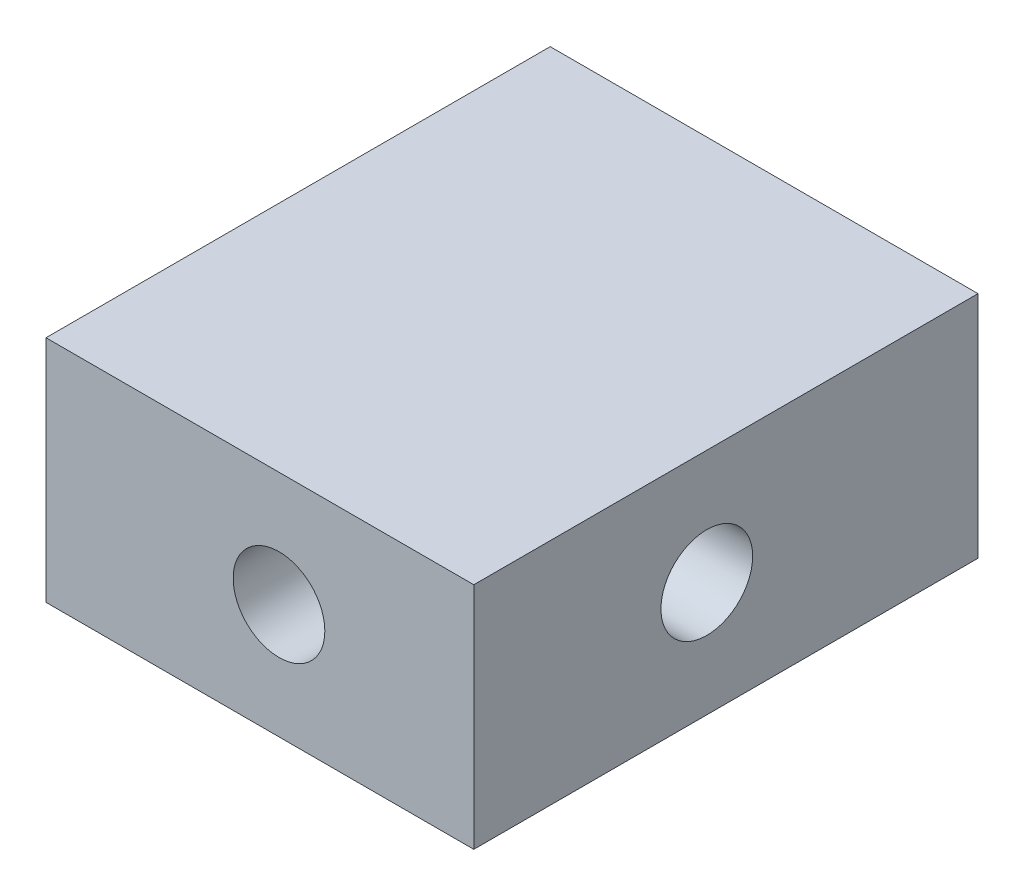
ISO-10303-21;
HEADER;
FILE_DESCRIPTION(('STEP AP214'),'2;1');
FILE_NAME('part.step','',(''),(''),'','','');
FILE_SCHEMA(('AUTOMOTIVE_DESIGN { 1 0 10303 214 1 1 1 1 }'));
ENDSEC;
DATA;
#1=APPLICATION_CONTEXT('core data for automotive mechanical design processes');
#2=APPLICATION_PROTOCOL_DEFINITION('international standard','automotive_design',2000,#1);
#3=PRODUCT_CONTEXT('',#1,'mechanical');
#4=PRODUCT('Part','Part','',(#3));
#5=PRODUCT_RELATED_PRODUCT_CATEGORY('part','',(#4));
#6=PRODUCT_DEFINITION_FORMATION('','',#4);
#7=PRODUCT_DEFINITION_CONTEXT('part definition',#1,'design');
#8=PRODUCT_DEFINITION('design','',#6,#7);
#9=PRODUCT_DEFINITION_SHAPE('','',#8);
#10=(LENGTH_UNIT() NAMED_UNIT(*) SI_UNIT(.MILLI.,.METRE.));
#11=(NAMED_UNIT(*) PLANE_ANGLE_UNIT() SI_UNIT($,.RADIAN.));
#12=(NAMED_UNIT(*) SI_UNIT($,.STERADIAN.) SOLID_ANGLE_UNIT());
#13=UNCERTAINTY_MEASURE_WITH_UNIT(LENGTH_MEASURE(1.E-05),#10,'distance_accuracy_value','');
#14=(GEOMETRIC_REPRESENTATION_CONTEXT(3) GLOBAL_UNCERTAINTY_ASSIGNED_CONTEXT((#13)) GLOBAL_UNIT_ASSIGNED_CONTEXT((#10,
#11,#12)) REPRESENTATION_CONTEXT('',''));
#15=CARTESIAN_POINT('',(0.,0.,0.));
#16=DIRECTION('',(0.,0.,1.));
#17=DIRECTION('',(1.,0.,0.));
#18=AXIS2_PLACEMENT_3D('',#15,#16,#17);
#19=CARTESIAN_POINT('',(0.,15.,0.));
#20=DIRECTION('',(1.,0.,0.));
#21=DIRECTION('',(0.,0.,-1.));
#22=AXIS2_PLACEMENT_3D('',#19,#20,#21);
#23=PLANE('',#22);
#24=DIRECTION('',(0.,0.,1.));
#25=VECTOR('',#24,1.);
#26=CARTESIAN_POINT('',(0.,0.,0.));
#27=LINE('',#26,#25);
#28=CARTESIAN_POINT('',(0.,0.,0.));
#29=VERTEX_POINT('',#28);
#30=CARTESIAN_POINT('',(0.,0.,33.));
#31=VERTEX_POINT('',#30);
#32=EDGE_CURVE('E101',#29,#31,#27,.T.);
#33=ORIENTED_EDGE('',*,*,#32,.T.);
#34=DIRECTION('',(0.,-1.,0.));
#35=VECTOR('',#34,1.);
#36=CARTESIAN_POINT('',(0.,15.,33.));
#37=LINE('',#36,#35);
#38=CARTESIAN_POINT('',(0.,15.,33.));
#39=VERTEX_POINT('',#38);
#40=EDGE_CURVE('E11',#39,#31,#37,.T.);
#41=ORIENTED_EDGE('',*,*,#40,.F.);
#42=DIRECTION('',(0.,0.,1.));
#43=VECTOR('',#42,1.);
#44=CARTESIAN_POINT('',(0.,15.,0.));
#45=LINE('',#44,#43);
#46=CARTESIAN_POINT('',(0.,15.,0.));
#47=VERTEX_POINT('',#46);
#48=EDGE_CURVE('E89',#47,#39,#45,.T.);
#49=ORIENTED_EDGE('',*,*,#48,.F.);
#50=DIRECTION('',(0.,-1.,0.));
#51=VECTOR('',#50,1.);
#52=CARTESIAN_POINT('',(0.,15.,0.));
#53=LINE('',#52,#51);
#54=EDGE_CURVE('E97',#47,#29,#53,.T.);
#55=ORIENTED_EDGE('',*,*,#54,.T.);
#56=EDGE_LOOP('',(#33,#41,#49,#55));
#57=FACE_BOUND('',#56,.T.);
#58=ADVANCED_FACE('F38',(#57),#23,.F.);
#59=CARTESIAN_POINT('',(0.,15.,33.));
#60=DIRECTION('',(0.,0.,-1.));
#61=DIRECTION('',(-1.,0.,0.));
#62=AXIS2_PLACEMENT_3D('',#59,#60,#61);
#63=PLANE('',#62);
#64=CARTESIAN_POINT('',(15.25,7.5,33.));
#65=DIRECTION('',(0.,0.,1.));
#66=DIRECTION('',(1.,0.,0.));
#67=AXIS2_PLACEMENT_3D('',#64,#65,#66);
#68=CIRCLE('',#67,3.);
#69=CARTESIAN_POINT('',(18.25,7.5,33.));
#70=VERTEX_POINT('',#69);
#71=EDGE_CURVE('E115',#70,#70,#68,.T.);
#72=ORIENTED_EDGE('',*,*,#71,.F.);
#73=EDGE_LOOP('',(#72));
#74=FACE_BOUND('',#73,.T.);
#75=DIRECTION('',(1.,0.,0.));
#76=VECTOR('',#75,1.);
#77=CARTESIAN_POINT('',(0.,0.,33.));
#78=LINE('',#77,#76);
#79=CARTESIAN_POINT('',(28.,0.,33.));
#80=VERTEX_POINT('',#79);
#81=EDGE_CURVE('E93',#31,#80,#78,.T.);
#82=ORIENTED_EDGE('',*,*,#81,.T.);
#83=DIRECTION('',(0.,-1.,0.));
#84=VECTOR('',#83,1.);
#85=CARTESIAN_POINT('',(28.,15.,33.));
#86=LINE('',#85,#84);
#87=CARTESIAN_POINT('',(28.,15.,33.));
#88=VERTEX_POINT('',#87);
#89=EDGE_CURVE('E46',#88,#80,#86,.T.);
#90=ORIENTED_EDGE('',*,*,#89,.F.);
#91=DIRECTION('',(1.,0.,0.));
#92=VECTOR('',#91,1.);
#93=CARTESIAN_POINT('',(0.,15.,33.));
#94=LINE('',#93,#92);
#95=EDGE_CURVE('E84',#39,#88,#94,.T.);
#96=ORIENTED_EDGE('',*,*,#95,.F.);
#97=ORIENTED_EDGE('',*,*,#40,.T.);
#98=EDGE_LOOP('',(#82,#90,#96,#97));
#99=FACE_BOUND('',#98,.T.);
#100=ADVANCED_FACE('F92',(#74,#99),#63,.F.);
#101=CARTESIAN_POINT('',(28.,15.,0.));
#102=DIRECTION('',(-1.,0.,0.));
#103=DIRECTION('',(0.,0.,1.));
#104=AXIS2_PLACEMENT_3D('',#101,#102,#103);
#105=PLANE('',#104);
#106=CARTESIAN_POINT('',(28.,7.5,17.75));
#107=DIRECTION('',(1.,0.,0.));
#108=DIRECTION('',(0.,0.,-1.));
#109=AXIS2_PLACEMENT_3D('',#106,#107,#108);
#110=CIRCLE('',#109,3.);
#111=CARTESIAN_POINT('',(28.,7.5,14.75));
#112=VERTEX_POINT('',#111);
#113=EDGE_CURVE('E121',#112,#112,#110,.T.);
#114=ORIENTED_EDGE('',*,*,#113,.F.);
#115=EDGE_LOOP('',(#114));
#116=FACE_BOUND('',#115,.T.);
#117=DIRECTION('',(0.,0.,-1.));
#118=VECTOR('',#117,1.);
#119=CARTESIAN_POINT('',(28.,0.,0.));
#120=LINE('',#119,#118);
#121=CARTESIAN_POINT('',(28.,0.,0.));
#122=VERTEX_POINT('',#121);
#123=EDGE_CURVE('E71',#80,#122,#120,.T.);
#124=ORIENTED_EDGE('',*,*,#123,.T.);
#125=DIRECTION('',(0.,-1.,0.));
#126=VECTOR('',#125,1.);
#127=CARTESIAN_POINT('',(28.,15.,0.));
#128=LINE('',#127,#126);
#129=CARTESIAN_POINT('',(28.,15.,0.));
#130=VERTEX_POINT('',#129);
#131=EDGE_CURVE('E94',#130,#122,#128,.T.);
#132=ORIENTED_EDGE('',*,*,#131,.F.);
#133=DIRECTION('',(0.,0.,-1.));
#134=VECTOR('',#133,1.);
#135=CARTESIAN_POINT('',(28.,15.,0.));
#136=LINE('',#135,#134);
#137=EDGE_CURVE('E87',#88,#130,#136,.T.);
#138=ORIENTED_EDGE('',*,*,#137,.F.);
#139=ORIENTED_EDGE('',*,*,#89,.T.);
#140=EDGE_LOOP('',(#124,#132,#138,#139));
#141=FACE_BOUND('',#140,.T.);
#142=ADVANCED_FACE('F95',(#116,#141),#105,.F.);
#143=CARTESIAN_POINT('',(0.,15.,0.));
#144=DIRECTION('',(0.,0.,1.));
#145=DIRECTION('',(1.,0.,0.));
#146=AXIS2_PLACEMENT_3D('',#143,#144,#145);
#147=PLANE('',#146);
#148=DIRECTION('',(-1.,0.,0.));
#149=VECTOR('',#148,1.);
#150=CARTESIAN_POINT('',(0.,0.,0.));
#151=LINE('',#150,#149);
#152=EDGE_CURVE('E77',#122,#29,#151,.T.);
#153=ORIENTED_EDGE('',*,*,#152,.T.);
#154=ORIENTED_EDGE('',*,*,#54,.F.);
#155=DIRECTION('',(-1.,0.,0.));
#156=VECTOR('',#155,1.);
#157=CARTESIAN_POINT('',(0.,15.,0.));
#158=LINE('',#157,#156);
#159=EDGE_CURVE('E54',#130,#47,#158,.T.);
#160=ORIENTED_EDGE('',*,*,#159,.F.);
#161=ORIENTED_EDGE('',*,*,#131,.T.);
#162=EDGE_LOOP('',(#153,#154,#160,#161));
#163=FACE_BOUND('',#162,.T.);
#164=ADVANCED_FACE('F109',(#163),#147,.F.);
#165=CARTESIAN_POINT('',(0.,15.,0.));
#166=DIRECTION('',(0.,1.,0.));
#167=DIRECTION('',(0.,0.,1.));
#168=AXIS2_PLACEMENT_3D('',#165,#166,#167);
#169=PLANE('',#168);
#170=ORIENTED_EDGE('',*,*,#48,.T.);
#171=ORIENTED_EDGE('',*,*,#95,.T.);
#172=ORIENTED_EDGE('',*,*,#137,.T.);
#173=ORIENTED_EDGE('',*,*,#159,.T.);
#174=EDGE_LOOP('',(#170,#171,#172,#173));
#175=FACE_BOUND('',#174,.T.);
#176=ADVANCED_FACE('F85',(#175),#169,.T.);
#177=CARTESIAN_POINT('',(0.,0.,0.));
#178=DIRECTION('',(0.,1.,0.));
#179=DIRECTION('',(0.,0.,1.));
#180=AXIS2_PLACEMENT_3D('',#177,#178,#179);
#181=PLANE('',#180);
#182=ORIENTED_EDGE('',*,*,#32,.F.);
#183=ORIENTED_EDGE('',*,*,#152,.F.);
#184=ORIENTED_EDGE('',*,*,#123,.F.);
#185=ORIENTED_EDGE('',*,*,#81,.F.);
#186=EDGE_LOOP('',(#182,#183,#184,#185));
#187=FACE_BOUND('',#186,.T.);
#188=ADVANCED_FACE('F112',(#187),#181,.F.);
#189=CARTESIAN_POINT('',(15.25,7.5,28.));
#190=DIRECTION('',(0.,0.,1.));
#191=DIRECTION('',(1.,0.,0.));
#192=AXIS2_PLACEMENT_3D('',#189,#190,#191);
#193=CYLINDRICAL_SURFACE('',#192,3.);
#194=CARTESIAN_POINT('',(15.25,7.5,28.));
#195=DIRECTION('',(0.,0.,1.));
#196=DIRECTION('',(1.,0.,0.));
#197=AXIS2_PLACEMENT_3D('',#194,#195,#196);
#198=CIRCLE('',#197,3.);
#199=CARTESIAN_POINT('',(18.25,7.5,28.));
#200=VERTEX_POINT('',#199);
#201=EDGE_CURVE('E104',#200,#200,#198,.T.);
#202=ORIENTED_EDGE('',*,*,#201,.F.);
#203=EDGE_LOOP('',(#202));
#204=FACE_BOUND('',#203,.T.);
#205=ORIENTED_EDGE('',*,*,#71,.T.);
#206=EDGE_LOOP('',(#205));
#207=FACE_BOUND('',#206,.T.);
#208=ADVANCED_FACE('F163',(#204,#207),#193,.F.);
#209=CARTESIAN_POINT('',(15.25,7.5,28.));
#210=DIRECTION('',(0.,0.,1.));
#211=DIRECTION('',(1.,0.,0.));
#212=AXIS2_PLACEMENT_3D('',#209,#210,#211);
#213=PLANE('',#212);
#214=ORIENTED_EDGE('',*,*,#201,.T.);
#215=EDGE_LOOP('',(#214));
#216=FACE_BOUND('',#215,.T.);
#217=ADVANCED_FACE('F132',(#216),#213,.T.);
#218=CARTESIAN_POINT('',(23.,7.5,17.75));
#219=DIRECTION('',(1.,0.,0.));
#220=DIRECTION('',(0.,0.,-1.));
#221=AXIS2_PLACEMENT_3D('',#218,#219,#220);
#222=CYLINDRICAL_SURFACE('',#221,3.);
#223=CARTESIAN_POINT('',(23.,7.5,17.75));
#224=DIRECTION('',(1.,0.,0.));
#225=DIRECTION('',(0.,0.,-1.));
#226=AXIS2_PLACEMENT_3D('',#223,#224,#225);
#227=CIRCLE('',#226,3.);
#228=CARTESIAN_POINT('',(23.,7.5,14.75));
#229=VERTEX_POINT('',#228);
#230=EDGE_CURVE('E118',#229,#229,#227,.T.);
#231=ORIENTED_EDGE('',*,*,#230,.F.);
#232=EDGE_LOOP('',(#231));
#233=FACE_BOUND('',#232,.T.);
#234=ORIENTED_EDGE('',*,*,#113,.T.);
#235=EDGE_LOOP('',(#234));
#236=FACE_BOUND('',#235,.T.);
#237=ADVANCED_FACE('F129',(#233,#236),#222,.F.);
#238=CARTESIAN_POINT('',(23.,7.5,17.75));
#239=DIRECTION('',(1.,0.,0.));
#240=DIRECTION('',(0.,0.,-1.));
#241=AXIS2_PLACEMENT_3D('',#238,#239,#240);
#242=PLANE('',#241);
#243=ORIENTED_EDGE('',*,*,#230,.T.);
#244=EDGE_LOOP('',(#243));
#245=FACE_BOUND('',#244,.T.);
#246=ADVANCED_FACE('F127',(#245),#242,.T.);
#247=CLOSED_SHELL('',(#58,#100,#142,#164,#176,#188,#208,#217,#237,#246));
#248=MANIFOLD_SOLID_BREP('B2',#247);
#249=ADVANCED_BREP_SHAPE_REPRESENTATION('',(#18,#248),#14);
#250=SHAPE_DEFINITION_REPRESENTATION(#9,#249);
ENDSEC;
END-ISO-10303-21;
